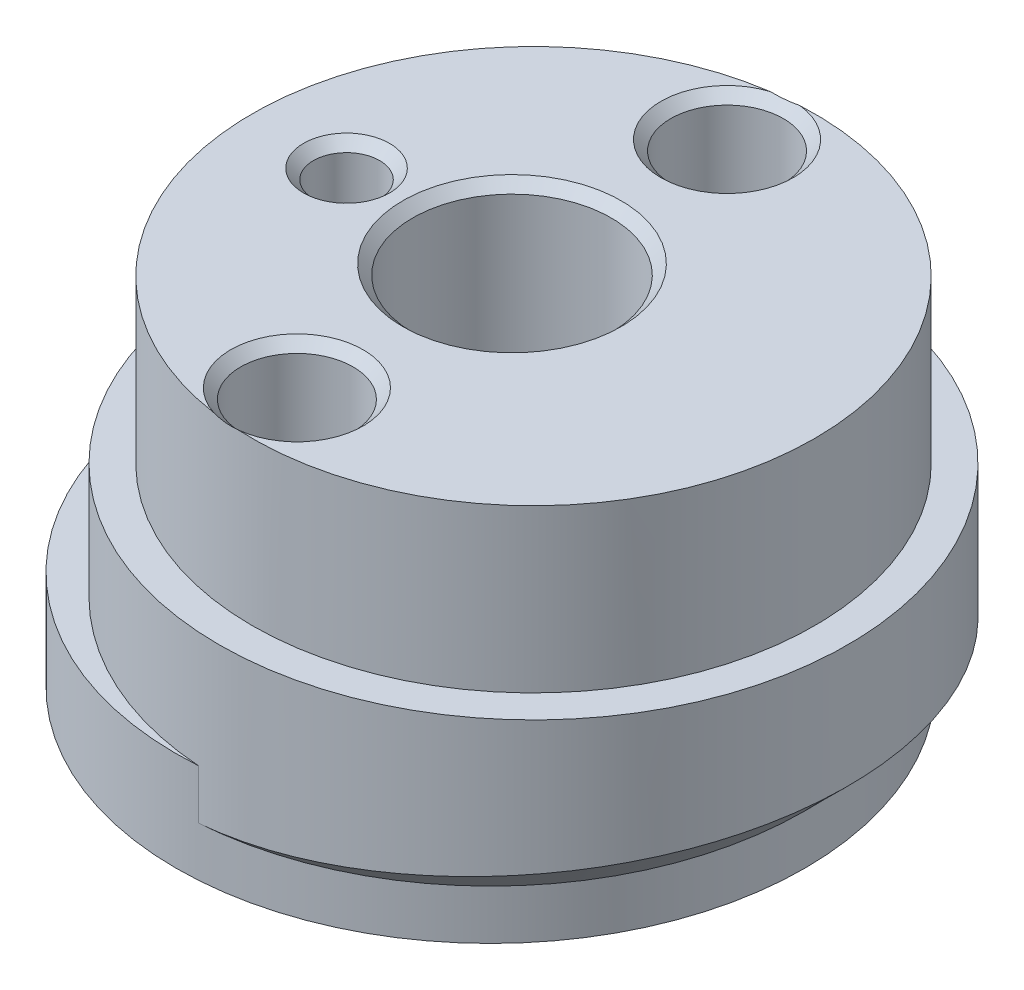
ISO-10303-21;
HEADER;
FILE_DESCRIPTION(('STEP AP214'),'2;1');
FILE_NAME('part.step','',(''),(''),'','','');
FILE_SCHEMA(('AUTOMOTIVE_DESIGN { 1 0 10303 214 1 1 1 1 }'));
ENDSEC;
DATA;
#1=APPLICATION_CONTEXT('core data for automotive mechanical design processes');
#2=APPLICATION_PROTOCOL_DEFINITION('international standard','automotive_design',2000,#1);
#3=PRODUCT_CONTEXT('',#1,'mechanical');
#4=PRODUCT('Part','Part','',(#3));
#5=PRODUCT_RELATED_PRODUCT_CATEGORY('part','',(#4));
#6=PRODUCT_DEFINITION_FORMATION('','',#4);
#7=PRODUCT_DEFINITION_CONTEXT('part definition',#1,'design');
#8=PRODUCT_DEFINITION('design','',#6,#7);
#9=PRODUCT_DEFINITION_SHAPE('','',#8);
#10=(LENGTH_UNIT() NAMED_UNIT(*) SI_UNIT(.MILLI.,.METRE.));
#11=(NAMED_UNIT(*) PLANE_ANGLE_UNIT() SI_UNIT($,.RADIAN.));
#12=(NAMED_UNIT(*) SI_UNIT($,.STERADIAN.) SOLID_ANGLE_UNIT());
#13=UNCERTAINTY_MEASURE_WITH_UNIT(LENGTH_MEASURE(1.E-05),#10,'distance_accuracy_value','');
#14=(GEOMETRIC_REPRESENTATION_CONTEXT(3) GLOBAL_UNCERTAINTY_ASSIGNED_CONTEXT((#13)) GLOBAL_UNIT_ASSIGNED_CONTEXT((#10,
#11,#12)) REPRESENTATION_CONTEXT('',''));
#15=CARTESIAN_POINT('',(0.,0.,0.));
#16=DIRECTION('',(0.,0.,1.));
#17=DIRECTION('',(1.,0.,0.));
#18=AXIS2_PLACEMENT_3D('',#15,#16,#17);
#19=CARTESIAN_POINT('',(-0.65,3.,0.));
#20=DIRECTION('',(0.,1.,0.));
#21=DIRECTION('',(0.,0.,1.));
#22=AXIS2_PLACEMENT_3D('',#19,#20,#21);
#23=PLANE('',#22);
#24=CARTESIAN_POINT('',(-0.65,3.,0.));
#25=DIRECTION('',(0.,1.,0.));
#26=DIRECTION('',(0.,0.,1.));
#27=AXIS2_PLACEMENT_3D('',#24,#25,#26);
#28=CIRCLE('',#27,9.5);
#29=CARTESIAN_POINT('',(0.,3.,-9.47773707168541));
#30=VERTEX_POINT('',#29);
#31=CARTESIAN_POINT('',(0.,3.,9.47773707168541));
#32=VERTEX_POINT('',#31);
#33=EDGE_CURVE('E85',#30,#32,#28,.T.);
#34=ORIENTED_EDGE('',*,*,#33,.T.);
#35=CARTESIAN_POINT('',(0.65,3.,0.));
#36=DIRECTION('',(0.,1.,0.));
#37=DIRECTION('',(0.,0.,1.));
#38=AXIS2_PLACEMENT_3D('',#35,#36,#37);
#39=CIRCLE('',#38,9.5);
#40=EDGE_CURVE('E93',#30,#32,#39,.T.);
#41=ORIENTED_EDGE('',*,*,#40,.F.);
#42=EDGE_LOOP('',(#34,#41));
#43=FACE_BOUND('',#42,.T.);
#44=ADVANCED_FACE('F37',(#43),#23,.T.);
#45=CARTESIAN_POINT('',(-0.65,0.,0.));
#46=DIRECTION('',(0.,1.,0.));
#47=DIRECTION('',(0.,0.,1.));
#48=AXIS2_PLACEMENT_3D('',#45,#46,#47);
#49=PLANE('',#48);
#50=CARTESIAN_POINT('',(0.,0.,-6.5));
#51=DIRECTION('',(0.,1.,0.));
#52=DIRECTION('',(0.,0.,1.));
#53=AXIS2_PLACEMENT_3D('',#50,#51,#52);
#54=CIRCLE('',#53,1.99999999999999);
#55=CARTESIAN_POINT('',(0.,0.,-4.50000000000001));
#56=VERTEX_POINT('',#55);
#57=EDGE_CURVE('E11',#56,#56,#54,.T.);
#58=ORIENTED_EDGE('',*,*,#57,.T.);
#59=EDGE_LOOP('',(#58));
#60=FACE_BOUND('',#59,.T.);
#61=CARTESIAN_POINT('',(-5.,0.,0.));
#62=DIRECTION('',(0.,1.,0.));
#63=DIRECTION('',(0.,0.,1.));
#64=AXIS2_PLACEMENT_3D('',#61,#62,#63);
#65=CIRCLE('',#64,1.3);
#66=CARTESIAN_POINT('',(-5.,0.,1.3));
#67=VERTEX_POINT('',#66);
#68=EDGE_CURVE('E46',#67,#67,#65,.T.);
#69=ORIENTED_EDGE('',*,*,#68,.T.);
#70=EDGE_LOOP('',(#69));
#71=FACE_BOUND('',#70,.T.);
#72=CARTESIAN_POINT('',(0.,0.,6.5));
#73=DIRECTION('',(0.,1.,0.));
#74=DIRECTION('',(0.,0.,1.));
#75=AXIS2_PLACEMENT_3D('',#72,#73,#74);
#76=CIRCLE('',#75,1.99999999999999);
#77=CARTESIAN_POINT('',(0.,0.,8.49999999999999));
#78=VERTEX_POINT('',#77);
#79=EDGE_CURVE('E194',#78,#78,#76,.T.);
#80=ORIENTED_EDGE('',*,*,#79,.T.);
#81=EDGE_LOOP('',(#80));
#82=FACE_BOUND('',#81,.T.);
#83=CARTESIAN_POINT('',(0.,0.,0.));
#84=DIRECTION('',(0.,1.,0.));
#85=DIRECTION('',(0.,0.,1.));
#86=AXIS2_PLACEMENT_3D('',#83,#84,#85);
#87=CIRCLE('',#86,3.3);
#88=CARTESIAN_POINT('',(0.,0.,3.3));
#89=VERTEX_POINT('',#88);
#90=EDGE_CURVE('E198',#89,#89,#87,.T.);
#91=ORIENTED_EDGE('',*,*,#90,.T.);
#92=EDGE_LOOP('',(#91));
#93=FACE_BOUND('',#92,.T.);
#94=CARTESIAN_POINT('',(-0.65,0.,0.));
#95=DIRECTION('',(0.,1.,0.));
#96=DIRECTION('',(0.,0.,1.));
#97=AXIS2_PLACEMENT_3D('',#94,#95,#96);
#98=CIRCLE('',#97,9.5);
#99=CARTESIAN_POINT('',(-0.65,0.,9.5));
#100=VERTEX_POINT('',#99);
#101=EDGE_CURVE('E94',#100,#100,#98,.T.);
#102=ORIENTED_EDGE('',*,*,#101,.F.);
#103=EDGE_LOOP('',(#102));
#104=FACE_BOUND('',#103,.T.);
#105=ADVANCED_FACE('F179',(#60,#71,#82,#93,#104),#49,.F.);
#106=CARTESIAN_POINT('',(-0.65,3.,0.));
#107=DIRECTION('',(0.,-1.,0.));
#108=DIRECTION('',(0.,0.,-1.));
#109=AXIS2_PLACEMENT_3D('',#106,#107,#108);
#110=CYLINDRICAL_SURFACE('',#109,9.5);
#111=ORIENTED_EDGE('',*,*,#33,.F.);
#112=DIRECTION('',(0.,-1.,0.));
#113=VECTOR('',#112,1.);
#114=CARTESIAN_POINT('',(0.,3.,-9.47773707168541));
#115=LINE('',#114,#113);
#116=CARTESIAN_POINT('',(0.,1.49999999999999,-9.47773707168541));
#117=VERTEX_POINT('',#116);
#118=EDGE_CURVE('E97',#30,#117,#115,.T.);
#119=ORIENTED_EDGE('',*,*,#118,.T.);
#120=CARTESIAN_POINT('',(-0.65,1.49999999999999,0.));
#121=DIRECTION('',(0.,1.,0.));
#122=DIRECTION('',(0.,0.,1.));
#123=AXIS2_PLACEMENT_3D('',#120,#121,#122);
#124=CIRCLE('',#123,9.5);
#125=CARTESIAN_POINT('',(0.,1.49999999999999,9.47773707168541));
#126=VERTEX_POINT('',#125);
#127=EDGE_CURVE('E88',#117,#126,#124,.F.);
#128=ORIENTED_EDGE('',*,*,#127,.T.);
#129=DIRECTION('',(0.,-1.,0.));
#130=VECTOR('',#129,1.);
#131=CARTESIAN_POINT('',(0.,1.49999999999999,9.47773707168541));
#132=LINE('',#131,#130);
#133=EDGE_CURVE('E80',#126,#32,#132,.F.);
#134=ORIENTED_EDGE('',*,*,#133,.T.);
#135=EDGE_LOOP('',(#111,#119,#128,#134));
#136=FACE_BOUND('',#135,.T.);
#137=ORIENTED_EDGE('',*,*,#101,.T.);
#138=EDGE_LOOP('',(#137));
#139=FACE_BOUND('',#138,.T.);
#140=ADVANCED_FACE('F82',(#136,#139),#110,.T.);
#141=CARTESIAN_POINT('',(0.,3.,0.));
#142=DIRECTION('',(0.,-1.,0.));
#143=DIRECTION('',(0.,0.,-1.));
#144=AXIS2_PLACEMENT_3D('',#141,#142,#143);
#145=CYLINDRICAL_SURFACE('',#144,3.);
#146=CARTESIAN_POINT('',(0.,11.1,0.));
#147=DIRECTION('',(0.,1.,0.));
#148=DIRECTION('',(0.,0.,1.));
#149=AXIS2_PLACEMENT_3D('',#146,#147,#148);
#150=CIRCLE('',#149,3.);
#151=CARTESIAN_POINT('',(0.,11.1,3.));
#152=VERTEX_POINT('',#151);
#153=EDGE_CURVE('E210',#152,#152,#150,.T.);
#154=ORIENTED_EDGE('',*,*,#153,.T.);
#155=EDGE_LOOP('',(#154));
#156=FACE_BOUND('',#155,.T.);
#157=CARTESIAN_POINT('',(0.,0.300000000000004,0.));
#158=DIRECTION('',(0.,1.,0.));
#159=DIRECTION('',(0.,0.,1.));
#160=AXIS2_PLACEMENT_3D('',#157,#158,#159);
#161=CIRCLE('',#160,3.);
#162=CARTESIAN_POINT('',(0.,0.300000000000004,3.));
#163=VERTEX_POINT('',#162);
#164=EDGE_CURVE('E213',#163,#163,#161,.F.);
#165=ORIENTED_EDGE('',*,*,#164,.T.);
#166=EDGE_LOOP('',(#165));
#167=FACE_BOUND('',#166,.T.);
#168=ADVANCED_FACE('F173',(#156,#167),#145,.F.);
#169=CARTESIAN_POINT('',(0.65,11.4,0.));
#170=DIRECTION('',(0.,1.,0.));
#171=DIRECTION('',(0.,0.,1.));
#172=AXIS2_PLACEMENT_3D('',#169,#170,#171);
#173=PLANE('',#172);
#174=CARTESIAN_POINT('',(0.,11.4,0.));
#175=DIRECTION('',(0.,1.,0.));
#176=DIRECTION('',(0.,0.,1.));
#177=AXIS2_PLACEMENT_3D('',#174,#175,#176);
#178=CIRCLE('',#177,3.3);
#179=CARTESIAN_POINT('',(0.,11.4,3.3));
#180=VERTEX_POINT('',#179);
#181=EDGE_CURVE('E265',#180,#180,#178,.F.);
#182=ORIENTED_EDGE('',*,*,#181,.T.);
#183=EDGE_LOOP('',(#182));
#184=FACE_BOUND('',#183,.T.);
#185=CARTESIAN_POINT('',(-5.,11.4,0.));
#186=DIRECTION('',(0.,1.,0.));
#187=DIRECTION('',(0.,0.,1.));
#188=AXIS2_PLACEMENT_3D('',#185,#186,#187);
#189=CIRCLE('',#188,1.3);
#190=CARTESIAN_POINT('',(-5.,11.4,1.3));
#191=VERTEX_POINT('',#190);
#192=EDGE_CURVE('E261',#191,#191,#189,.F.);
#193=ORIENTED_EDGE('',*,*,#192,.T.);
#194=EDGE_LOOP('',(#193));
#195=FACE_BOUND('',#194,.T.);
#196=CARTESIAN_POINT('',(0.65,11.4,0.));
#197=DIRECTION('',(0.,1.,0.));
#198=DIRECTION('',(0.,0.,1.));
#199=AXIS2_PLACEMENT_3D('',#196,#197,#198);
#200=CIRCLE('',#199,8.5);
#201=CARTESIAN_POINT('',(-0.60176007472003,11.4,-8.407323992528));
#202=VERTEX_POINT('',#201);
#203=CARTESIAN_POINT('',(-0.601760074720063,11.4,8.40732399252799));
#204=VERTEX_POINT('',#203);
#205=EDGE_CURVE('E108',#202,#204,#200,.T.);
#206=ORIENTED_EDGE('',*,*,#205,.T.);
#207=CARTESIAN_POINT('',(0.,11.4,6.5));
#208=DIRECTION('',(0.,1.,0.));
#209=DIRECTION('',(0.,0.,1.));
#210=AXIS2_PLACEMENT_3D('',#207,#208,#209);
#211=CIRCLE('',#210,2.00000000000001);
#212=CARTESIAN_POINT('',(0.212156114324024,11.4,8.4887156114324));
#213=VERTEX_POINT('',#212);
#214=EDGE_CURVE('E272',#204,#213,#211,.F.);
#215=ORIENTED_EDGE('',*,*,#214,.T.);
#216=CARTESIAN_POINT('',(0.212156114323991,11.4,-8.4887156114324));
#217=VERTEX_POINT('',#216);
#218=EDGE_CURVE('E102',#213,#217,#200,.T.);
#219=ORIENTED_EDGE('',*,*,#218,.T.);
#220=CARTESIAN_POINT('',(0.,11.4,-6.5));
#221=DIRECTION('',(0.,1.,0.));
#222=DIRECTION('',(0.,0.,1.));
#223=AXIS2_PLACEMENT_3D('',#220,#221,#222);
#224=CIRCLE('',#223,2.);
#225=EDGE_CURVE('E270',#217,#202,#224,.F.);
#226=ORIENTED_EDGE('',*,*,#225,.T.);
#227=EDGE_LOOP('',(#206,#215,#219,#226));
#228=FACE_BOUND('',#227,.T.);
#229=ADVANCED_FACE('F171',(#184,#195,#228),#173,.T.);
#230=CARTESIAN_POINT('',(0.65,11.4,0.));
#231=DIRECTION('',(0.,-1.,0.));
#232=DIRECTION('',(0.,0.,-1.));
#233=AXIS2_PLACEMENT_3D('',#230,#231,#232);
#234=CYLINDRICAL_SURFACE('',#233,8.5);
#235=CARTESIAN_POINT('',(0.65,6.5,0.));
#236=DIRECTION('',(0.,1.,0.));
#237=DIRECTION('',(0.,0.,1.));
#238=AXIS2_PLACEMENT_3D('',#235,#236,#237);
#239=CIRCLE('',#238,8.5);
#240=CARTESIAN_POINT('',(0.65,6.5,8.5));
#241=VERTEX_POINT('',#240);
#242=EDGE_CURVE('E99',#241,#241,#239,.T.);
#243=ORIENTED_EDGE('',*,*,#242,.T.);
#244=EDGE_LOOP('',(#243));
#245=FACE_BOUND('',#244,.T.);
#246=ORIENTED_EDGE('',*,*,#218,.F.);
#247=CARTESIAN_POINT('',(0.212156114324024,11.4,8.4887156114324));
#248=CARTESIAN_POINT('',(0.144388372843662,11.3892925743724,8.48522715447326));
#249=CARTESIAN_POINT('',(0.0762379554762486,11.3811689720129,8.48089135470946));
#250=CARTESIAN_POINT('',(-0.0598975572980804,11.3703312636197,8.47057520845634));
#251=CARTESIAN_POINT('',(-0.127880639625246,11.3675808462714,8.46460621399023));
#252=CARTESIAN_POINT('',(-0.263682583731735,11.3675808462714,8.45102601957958));
#253=CARTESIAN_POINT('',(-0.331501445511057,11.3703312636197,8.44341481963504));
#254=CARTESIAN_POINT('',(-0.466984006795423,11.3811689720129,8.42656915848229));
#255=CARTESIAN_POINT('',(-0.534643485158293,11.3892925743724,8.41732396867306));
#256=CARTESIAN_POINT('',(-0.601760074720063,11.4,8.40732399252799));
#257=B_SPLINE_CURVE_WITH_KNOTS('',3,(#247,#248,#249,#250,#251,#252,#253,#254,#255,#256),
.UNSPECIFIED.,.F.,.F.,(4,2,2,2,4),(0.,0.206064885541673,0.410732326139946,0.615399766738218,
0.821464652279891),.UNSPECIFIED.);
#258=EDGE_CURVE('E52',#213,#204,#257,.T.);
#259=ORIENTED_EDGE('',*,*,#258,.T.);
#260=ORIENTED_EDGE('',*,*,#205,.F.);
#261=CARTESIAN_POINT('',(-0.60176007472003,11.4,-8.407323992528));
#262=CARTESIAN_POINT('',(-0.534643485158266,11.3892925743724,-8.41732396867306));
#263=CARTESIAN_POINT('',(-0.466984006795401,11.3811689720129,-8.42656915848229));
#264=CARTESIAN_POINT('',(-0.331501445511047,11.3703312636197,-8.44341481963504));
#265=CARTESIAN_POINT('',(-0.26368258373173,11.3675808462714,-8.45102601957958));
#266=CARTESIAN_POINT('',(-0.127880639625252,11.3675808462714,-8.46460621399023));
#267=CARTESIAN_POINT('',(-0.0598975572980918,11.3703312636197,-8.47057520845634));
#268=CARTESIAN_POINT('',(0.0762379554762261,11.3811689720129,-8.48089135470946));
#269=CARTESIAN_POINT('',(0.144388372843634,11.3892925743724,-8.48522715447326));
#270=CARTESIAN_POINT('',(0.212156114323991,11.4,-8.4887156114324));
#271=B_SPLINE_CURVE_WITH_KNOTS('',3,(#261,#262,#263,#264,#265,#266,#267,#268,#269,#270),
.UNSPECIFIED.,.F.,.F.,(4,2,2,2,4),(0.,0.206064885541656,0.410732326139912,0.615399766738168,
0.821464652279824),.UNSPECIFIED.);
#272=EDGE_CURVE('E159',#202,#217,#271,.T.);
#273=ORIENTED_EDGE('',*,*,#272,.T.);
#274=EDGE_LOOP('',(#246,#259,#260,#273));
#275=FACE_BOUND('',#274,.T.);
#276=ADVANCED_FACE('F166',(#245,#275),#234,.T.);
#277=CARTESIAN_POINT('',(0.65,6.5,0.));
#278=DIRECTION('',(0.,1.,0.));
#279=DIRECTION('',(0.,0.,1.));
#280=AXIS2_PLACEMENT_3D('',#277,#278,#279);
#281=PLANE('',#280);
#282=CARTESIAN_POINT('',(0.65,6.5,0.));
#283=DIRECTION('',(0.,1.,0.));
#284=DIRECTION('',(0.,0.,1.));
#285=AXIS2_PLACEMENT_3D('',#282,#283,#284);
#286=CIRCLE('',#285,9.5);
#287=CARTESIAN_POINT('',(0.65,6.5,9.5));
#288=VERTEX_POINT('',#287);
#289=EDGE_CURVE('E98',#288,#288,#286,.T.);
#290=ORIENTED_EDGE('',*,*,#289,.T.);
#291=EDGE_LOOP('',(#290));
#292=FACE_BOUND('',#291,.T.);
#293=ORIENTED_EDGE('',*,*,#242,.F.);
#294=EDGE_LOOP('',(#293));
#295=FACE_BOUND('',#294,.T.);
#296=ADVANCED_FACE('F170',(#292,#295),#281,.T.);
#297=CARTESIAN_POINT('',(0.65,6.5,0.));
#298=DIRECTION('',(0.,-1.,0.));
#299=DIRECTION('',(0.,0.,-1.));
#300=AXIS2_PLACEMENT_3D('',#297,#298,#299);
#301=CYLINDRICAL_SURFACE('',#300,9.5);
#302=ORIENTED_EDGE('',*,*,#289,.F.);
#303=EDGE_LOOP('',(#302));
#304=FACE_BOUND('',#303,.T.);
#305=ORIENTED_EDGE('',*,*,#40,.T.);
#306=ORIENTED_EDGE('',*,*,#133,.F.);
#307=CARTESIAN_POINT('',(0.,1.49999999999999,9.47773707168541));
#308=CARTESIAN_POINT('',(0.232436584391314,1.53180821684885,9.49369332138629));
#309=CARTESIAN_POINT('',(0.465470345312506,1.563536225383,9.50106951453613));
#310=CARTESIAN_POINT('',(0.931466069386569,1.62667141698054,9.49868320359915));
#311=CARTESIAN_POINT('',(1.16442803774315,1.6580786370265,9.48892269809398));
#312=CARTESIAN_POINT('',(1.62920901122623,1.72043814462735,9.45227706347286));
#313=CARTESIAN_POINT('',(1.8610272417912,1.75139014621388,9.42538160397508));
#314=CARTESIAN_POINT('',(2.32215274271935,1.81267221106095,9.35458839540783));
#315=CARTESIAN_POINT('',(2.5514597599179,1.84300221187944,9.31068894803707));
#316=CARTESIAN_POINT('',(3.04157480360545,1.9075370506566,9.19798893888884));
#317=CARTESIAN_POINT('',(3.30175984199074,1.941614292781,9.12638437549389));
#318=CARTESIAN_POINT('',(3.81525681363404,2.00853574698814,8.96124446939764));
#319=CARTESIAN_POINT('',(4.06856806322071,2.04137983654447,8.86770695408664));
#320=CARTESIAN_POINT('',(4.56645435283187,2.10563275767199,8.65934203190355));
#321=CARTESIAN_POINT('',(4.81102985300043,2.13704166486392,8.54451574836744));
#322=CARTESIAN_POINT('',(5.28967090615107,2.19823910396925,8.29435791194216));
#323=CARTESIAN_POINT('',(5.52373650303971,2.22802764265206,8.15902644472654));
#324=CARTESIAN_POINT('',(5.97848781651825,2.28566452822138,7.86952997173259));
#325=CARTESIAN_POINT('',(6.19923513720743,2.31352191413262,7.7154635357134));
#326=CARTESIAN_POINT('',(6.62701004842578,2.36730193225397,7.38902824390842));
#327=CARTESIAN_POINT('',(6.83403757816316,2.39322455589131,7.21665930703388));
#328=CARTESIAN_POINT('',(7.23284774632427,2.44298920010898,6.85482388101035));
#329=CARTESIAN_POINT('',(7.42463011624049,2.46683118404447,6.66535709084847));
#330=CARTESIAN_POINT('',(7.79152017615291,2.51230086474213,6.27066861411746));
#331=CARTESIAN_POINT('',(7.96662800099755,2.53392857941137,6.06544705498272));
#332=CARTESIAN_POINT('',(8.2975777600226,2.57469217089468,5.64235163886782));
#333=CARTESIAN_POINT('',(8.45355792531459,2.59384598719644,5.4245876260193));
#334=CARTESIAN_POINT('',(8.74665830851183,2.62975230375792,4.97652403175809));
#335=CARTESIAN_POINT('',(8.88377829476701,2.64650477452325,4.74622429642393));
#336=CARTESIAN_POINT('',(9.13815920698065,2.67752099475245,4.27468509180481));
#337=CARTESIAN_POINT('',(9.25541610553925,2.69178423952354,4.03344341649459));
#338=CARTESIAN_POINT('',(9.4691560548584,2.71774109930763,3.54179816560406));
#339=CARTESIAN_POINT('',(9.56563956384372,2.72943477100106,3.29139479225741));
#340=CARTESIAN_POINT('',(9.73655811724458,2.7501236030752,2.78486076659791));
#341=CARTESIAN_POINT('',(9.81113088321605,2.75913562394349,2.52877726737606));
#342=CARTESIAN_POINT('',(9.93849779913183,2.77451407015589,2.01117884292822));
#343=CARTESIAN_POINT('',(9.99129247361882,2.78088055921976,1.74966404867865));
#344=CARTESIAN_POINT('',(10.0746605163158,2.7909287192388,1.22338295574531));
#345=CARTESIAN_POINT('',(10.1052603580091,2.79461358878522,0.958620915079021));
#346=CARTESIAN_POINT('',(10.1441087893971,2.79929109671774,0.427528036218858));
#347=CARTESIAN_POINT('',(10.1523640149439,2.8002845343991,0.161197687329976));
#348=CARTESIAN_POINT('',(10.1460108959082,2.79951985614703,-0.413196254885565));
#349=CARTESIAN_POINT('',(10.1275954363374,2.79730356801804,-0.721223988292627));
#350=CARTESIAN_POINT('',(10.0609224684857,2.78927311993757,-1.33398679388979));
#351=CARTESIAN_POINT('',(10.0126647103961,2.7834589298682,-1.6387218384952));
#352=CARTESIAN_POINT('',(9.89502855725859,2.7692672581326,-2.20254918652843));
#353=CARTESIAN_POINT('',(9.82923048043059,2.76132357345043,-2.46240590741267));
#354=CARTESIAN_POINT('',(9.67592561702521,2.74278793358012,-2.9756352350986));
#355=CARTESIAN_POINT('',(9.58841217676339,2.73219516669351,-3.2290058282234));
#356=CARTESIAN_POINT('',(9.39222823588825,2.70840487477214,-3.72764241019848));
#357=CARTESIAN_POINT('',(9.28353237505346,2.69520422724236,-3.97289826799793));
#358=CARTESIAN_POINT('',(9.04586478884183,2.66627664961125,-4.45322968226967));
#359=CARTESIAN_POINT('',(8.91689280248467,2.65054968699288,-4.68830510765676));
#360=CARTESIAN_POINT('',(8.64090347596971,2.61680888604399,-5.14450049865271));
#361=CARTESIAN_POINT('',(8.49406135899511,2.5988172023079,-5.36572814900869));
#362=CARTESIAN_POINT('',(8.18248678758145,2.56053180379765,-5.79499615974519));
#363=CARTESIAN_POINT('',(8.0177541297776,2.5402380628555,-6.00303637017929));
#364=CARTESIAN_POINT('',(7.67169537053372,2.49746945010971,-6.40437041371224));
#365=CARTESIAN_POINT('',(7.49037893623939,2.47499584855114,-6.59767271895057));
#366=CARTESIAN_POINT('',(7.11229678899895,2.42796838552798,-6.96841804302689));
#367=CARTESIAN_POINT('',(6.91552455581397,2.40341364575792,-7.14585430032387));
#368=CARTESIAN_POINT('',(6.50679209760863,2.35221322068639,-7.48457431358038));
#369=CARTESIAN_POINT('',(6.29474848087738,2.32555596504399,-7.64575569555617));
#370=CARTESIAN_POINT('',(5.85813491226568,2.27043863693001,-7.94959367745174));
#371=CARTESIAN_POINT('',(5.63357016511824,2.24197931287741,-8.09225789364692));
#372=CARTESIAN_POINT('',(5.17327975050108,2.18338774772581,-8.35826807709909));
#373=CARTESIAN_POINT('',(4.93754662698258,2.15325438664954,-8.4816008950685));
#374=CARTESIAN_POINT('',(4.456739850499,2.09150517435469,-8.70800429005668));
#375=CARTESIAN_POINT('',(4.21166645998743,2.05988936478591,-8.81107543591067));
#376=CARTESIAN_POINT('',(3.71183380276946,1.99509010255401,-8.99704768595076));
#377=CARTESIAN_POINT('',(3.45701107709749,1.96189582587695,-9.07977447561619));
#378=CARTESIAN_POINT('',(2.94143306272732,1.89438553611957,-9.22339102527994));
#379=CARTESIAN_POINT('',(2.68067786283761,1.8600695398279,-9.28428111194287));
#380=CARTESIAN_POINT('',(2.1554602556977,1.79057722208004,-9.38375915266908));
#381=CARTESIAN_POINT('',(1.89100363742311,1.7554021912552,-9.42237864777947));
#382=CARTESIAN_POINT('',(1.35997597734251,1.68437903173459,-9.47718956387327));
#383=CARTESIAN_POINT('',(1.09340611816341,1.64853126601051,-9.49339274580365));
#384=CARTESIAN_POINT('',(0.688742602638314,1.59380422752349,-9.50092414274325));
#385=CARTESIAN_POINT('',(0.550734397775085,1.57508544314292,-9.50048348119238));
#386=CARTESIAN_POINT('',(0.275086760629968,1.53758757821641,-9.49359860986214));
#387=CARTESIAN_POINT('',(0.137447085635779,1.51880863004613,-9.48716339681042));
#388=CARTESIAN_POINT('',(0.,1.49999999999999,-9.47773707168541));
#389=B_SPLINE_CURVE_WITH_KNOTS('',3,(#307,#308,#309,#310,#311,#312,#313,#314,#315,#316,#317,
#318,#319,#320,#321,#322,#323,#324,#325,#326,#327,#328,#329,#330,#331,#332,#333,#334,#335,#336,
#337,#338,#339,#340,#341,#342,#343,#344,#345,#346,#347,#348,#349,#350,#351,#352,#353,#354,#355,
#356,#357,#358,#359,#360,#361,#362,#363,#364,#365,#366,#367,#368,#369,#370,#371,#372,#373,#374,
#375,#376,#377,#378,#379,#380,#381,#382,#383,#384,#385,#386,#387,#388),.UNSPECIFIED.,.F.,.F.,(4,
2,2,2,2,2,2,2,2,2,2,2,2,2,2,2,2,2,2,2,2,2,2,2,2,2,2,2,2,2,2,2,2,2,2,2,2,2,2,2,4),(0.,
0.705274449051662,1.41046665035117,2.11608440326432,2.82177264909223,3.63678092014131,
4.45186995749426,5.26691599760207,6.08195863242664,6.8928849348359,7.70381483018291,
8.51475900498275,9.32569662105216,10.1303770016659,10.9350672648802,11.7399204906961,
12.5447559610333,13.3444186975758,14.14406217248,14.9427502755812,15.741201160109,
16.6654494954795,17.589705567801,18.3932850038446,19.1971109649165,20.0019052690012,
20.8067099326911,21.6041778401001,22.4016548134094,23.1986698424502,23.9960229278514,
24.7981196054806,25.5998853210282,26.4021940557483,27.2044802628766,28.0134182075097,
28.8223440503886,29.6301214087431,30.4374747975498,30.8551793169807,31.2722579464565),.UNSPECIFIED.);
#390=EDGE_CURVE('E114',#126,#117,#389,.T.);
#391=ORIENTED_EDGE('',*,*,#390,.T.);
#392=ORIENTED_EDGE('',*,*,#118,.F.);
#393=EDGE_LOOP('',(#305,#306,#391,#392));
#394=FACE_BOUND('',#393,.T.);
#395=ADVANCED_FACE('F96',(#304,#394),#301,.T.);
#396=CARTESIAN_POINT('',(-0.65,3.,0.));
#397=DIRECTION('',(0.,1.,0.));
#398=DIRECTION('',(0.,0.,1.));
#399=AXIS2_PLACEMENT_3D('',#396,#397,#398);
#400=CONICAL_SURFACE('',#399,11.,0.785398163397453);
#401=ORIENTED_EDGE('',*,*,#390,.F.);
#402=ORIENTED_EDGE('',*,*,#127,.F.);
#403=EDGE_LOOP('',(#401,#402));
#404=FACE_BOUND('',#403,.T.);
#405=ADVANCED_FACE('F128',(#404),#400,.T.);
#406=CARTESIAN_POINT('',(-5.,0.,0.));
#407=DIRECTION('',(0.,1.,0.));
#408=DIRECTION('',(0.,0.,1.));
#409=AXIS2_PLACEMENT_3D('',#406,#407,#408);
#410=CYLINDRICAL_SURFACE('',#409,1.);
#411=CARTESIAN_POINT('',(-5.,11.1,0.));
#412=DIRECTION('',(0.,1.,0.));
#413=DIRECTION('',(0.,0.,1.));
#414=AXIS2_PLACEMENT_3D('',#411,#412,#413);
#415=CIRCLE('',#414,1.);
#416=CARTESIAN_POINT('',(-5.,11.1,1.));
#417=VERTEX_POINT('',#416);
#418=EDGE_CURVE('E201',#417,#417,#415,.T.);
#419=ORIENTED_EDGE('',*,*,#418,.T.);
#420=EDGE_LOOP('',(#419));
#421=FACE_BOUND('',#420,.T.);
#422=CARTESIAN_POINT('',(-5.,0.300000000000002,0.));
#423=DIRECTION('',(0.,1.,0.));
#424=DIRECTION('',(0.,0.,1.));
#425=AXIS2_PLACEMENT_3D('',#422,#423,#424);
#426=CIRCLE('',#425,1.);
#427=CARTESIAN_POINT('',(-5.,0.300000000000002,1.));
#428=VERTEX_POINT('',#427);
#429=EDGE_CURVE('E205',#428,#428,#426,.F.);
#430=ORIENTED_EDGE('',*,*,#429,.T.);
#431=EDGE_LOOP('',(#430));
#432=FACE_BOUND('',#431,.T.);
#433=ADVANCED_FACE('F136',(#421,#432),#410,.F.);
#434=CARTESIAN_POINT('',(0.,11.4,6.5));
#435=DIRECTION('',(0.,1.,0.));
#436=DIRECTION('',(0.,0.,1.));
#437=AXIS2_PLACEMENT_3D('',#434,#435,#436);
#438=CYLINDRICAL_SURFACE('',#437,1.7);
#439=CARTESIAN_POINT('',(0.,11.1,6.5));
#440=DIRECTION('',(0.,1.,0.));
#441=DIRECTION('',(0.,0.,1.));
#442=AXIS2_PLACEMENT_3D('',#439,#440,#441);
#443=CIRCLE('',#442,1.7);
#444=CARTESIAN_POINT('',(0.,11.1,8.2));
#445=VERTEX_POINT('',#444);
#446=EDGE_CURVE('E259',#445,#445,#443,.T.);
#447=ORIENTED_EDGE('',*,*,#446,.T.);
#448=EDGE_LOOP('',(#447));
#449=FACE_BOUND('',#448,.T.);
#450=CARTESIAN_POINT('',(0.,0.299999999999996,6.5));
#451=DIRECTION('',(0.,1.,0.));
#452=DIRECTION('',(0.,0.,1.));
#453=AXIS2_PLACEMENT_3D('',#450,#451,#452);
#454=CIRCLE('',#453,1.7);
#455=CARTESIAN_POINT('',(0.,0.299999999999996,8.2));
#456=VERTEX_POINT('',#455);
#457=EDGE_CURVE('E122',#456,#456,#454,.F.);
#458=ORIENTED_EDGE('',*,*,#457,.T.);
#459=EDGE_LOOP('',(#458));
#460=FACE_BOUND('',#459,.T.);
#461=ADVANCED_FACE('F305',(#449,#460),#438,.F.);
#462=CARTESIAN_POINT('',(0.,11.4,-6.5));
#463=DIRECTION('',(0.,1.,0.));
#464=DIRECTION('',(0.,0.,1.));
#465=AXIS2_PLACEMENT_3D('',#462,#463,#464);
#466=CYLINDRICAL_SURFACE('',#465,1.7);
#467=CARTESIAN_POINT('',(0.,11.1,-6.5));
#468=DIRECTION('',(0.,1.,0.));
#469=DIRECTION('',(0.,0.,1.));
#470=AXIS2_PLACEMENT_3D('',#467,#468,#469);
#471=CIRCLE('',#470,1.7);
#472=CARTESIAN_POINT('',(0.,11.1,-4.8));
#473=VERTEX_POINT('',#472);
#474=EDGE_CURVE('E215',#473,#473,#471,.T.);
#475=ORIENTED_EDGE('',*,*,#474,.T.);
#476=EDGE_LOOP('',(#475));
#477=FACE_BOUND('',#476,.T.);
#478=CARTESIAN_POINT('',(0.,0.3,-6.5));
#479=DIRECTION('',(0.,1.,0.));
#480=DIRECTION('',(0.,0.,1.));
#481=AXIS2_PLACEMENT_3D('',#478,#479,#480);
#482=CIRCLE('',#481,1.7);
#483=CARTESIAN_POINT('',(0.,0.3,-4.8));
#484=VERTEX_POINT('',#483);
#485=EDGE_CURVE('E158',#484,#484,#482,.F.);
#486=ORIENTED_EDGE('',*,*,#485,.T.);
#487=EDGE_LOOP('',(#486));
#488=FACE_BOUND('',#487,.T.);
#489=ADVANCED_FACE('F147',(#477,#488),#466,.F.);
#490=CARTESIAN_POINT('',(0.,11.1,6.5));
#491=DIRECTION('',(0.,1.,0.));
#492=DIRECTION('',(0.,0.,1.));
#493=AXIS2_PLACEMENT_3D('',#490,#491,#492);
#494=CONICAL_SURFACE('',#493,1.7,0.785398163397455);
#495=ORIENTED_EDGE('',*,*,#258,.F.);
#496=ORIENTED_EDGE('',*,*,#214,.F.);
#497=EDGE_LOOP('',(#495,#496));
#498=FACE_BOUND('',#497,.T.);
#499=ORIENTED_EDGE('',*,*,#446,.F.);
#500=EDGE_LOOP('',(#499));
#501=FACE_BOUND('',#500,.T.);
#502=ADVANCED_FACE('F139',(#498,#501),#494,.F.);
#503=CARTESIAN_POINT('',(0.,11.1,-6.5));
#504=DIRECTION('',(0.,1.,0.));
#505=DIRECTION('',(0.,0.,1.));
#506=AXIS2_PLACEMENT_3D('',#503,#504,#505);
#507=CONICAL_SURFACE('',#506,1.7,0.785398163397445);
#508=ORIENTED_EDGE('',*,*,#272,.F.);
#509=ORIENTED_EDGE('',*,*,#225,.F.);
#510=EDGE_LOOP('',(#508,#509));
#511=FACE_BOUND('',#510,.T.);
#512=ORIENTED_EDGE('',*,*,#474,.F.);
#513=EDGE_LOOP('',(#512));
#514=FACE_BOUND('',#513,.T.);
#515=ADVANCED_FACE('F146',(#511,#514),#507,.F.);
#516=CARTESIAN_POINT('',(0.,11.1,0.));
#517=DIRECTION('',(0.,1.,0.));
#518=DIRECTION('',(0.,0.,1.));
#519=AXIS2_PLACEMENT_3D('',#516,#517,#518);
#520=CONICAL_SURFACE('',#519,3.,0.785398163397452);
#521=ORIENTED_EDGE('',*,*,#181,.F.);
#522=EDGE_LOOP('',(#521));
#523=FACE_BOUND('',#522,.T.);
#524=ORIENTED_EDGE('',*,*,#153,.F.);
#525=EDGE_LOOP('',(#524));
#526=FACE_BOUND('',#525,.T.);
#527=ADVANCED_FACE('F236',(#523,#526),#520,.F.);
#528=CARTESIAN_POINT('',(-5.,11.1,0.));
#529=DIRECTION('',(0.,1.,0.));
#530=DIRECTION('',(0.,0.,1.));
#531=AXIS2_PLACEMENT_3D('',#528,#529,#530);
#532=CONICAL_SURFACE('',#531,1.,0.785398163397453);
#533=ORIENTED_EDGE('',*,*,#192,.F.);
#534=EDGE_LOOP('',(#533));
#535=FACE_BOUND('',#534,.T.);
#536=ORIENTED_EDGE('',*,*,#418,.F.);
#537=EDGE_LOOP('',(#536));
#538=FACE_BOUND('',#537,.T.);
#539=ADVANCED_FACE('F227',(#535,#538),#532,.F.);
#540=CARTESIAN_POINT('',(0.,0.,-6.5));
#541=DIRECTION('',(0.,-1.,0.));
#542=DIRECTION('',(0.,0.,-1.));
#543=AXIS2_PLACEMENT_3D('',#540,#541,#542);
#544=CONICAL_SURFACE('',#543,1.99999999999999,0.785398163397442);
#545=ORIENTED_EDGE('',*,*,#485,.F.);
#546=EDGE_LOOP('',(#545));
#547=FACE_BOUND('',#546,.T.);
#548=ORIENTED_EDGE('',*,*,#57,.F.);
#549=EDGE_LOOP('',(#548));
#550=FACE_BOUND('',#549,.T.);
#551=ADVANCED_FACE('F223',(#547,#550),#544,.F.);
#552=CARTESIAN_POINT('',(-5.,0.,0.));
#553=DIRECTION('',(0.,-1.,0.));
#554=DIRECTION('',(0.,0.,-1.));
#555=AXIS2_PLACEMENT_3D('',#552,#553,#554);
#556=CONICAL_SURFACE('',#555,1.3,0.785398163397443);
#557=ORIENTED_EDGE('',*,*,#429,.F.);
#558=EDGE_LOOP('',(#557));
#559=FACE_BOUND('',#558,.T.);
#560=ORIENTED_EDGE('',*,*,#68,.F.);
#561=EDGE_LOOP('',(#560));
#562=FACE_BOUND('',#561,.T.);
#563=ADVANCED_FACE('F226',(#559,#562),#556,.F.);
#564=CARTESIAN_POINT('',(0.,0.,6.5));
#565=DIRECTION('',(0.,-1.,0.));
#566=DIRECTION('',(0.,0.,-1.));
#567=AXIS2_PLACEMENT_3D('',#564,#565,#566);
#568=CONICAL_SURFACE('',#567,1.99999999999999,0.785398163397444);
#569=ORIENTED_EDGE('',*,*,#457,.F.);
#570=EDGE_LOOP('',(#569));
#571=FACE_BOUND('',#570,.T.);
#572=ORIENTED_EDGE('',*,*,#79,.F.);
#573=EDGE_LOOP('',(#572));
#574=FACE_BOUND('',#573,.T.);
#575=ADVANCED_FACE('F233',(#571,#574),#568,.F.);
#576=CARTESIAN_POINT('',(0.,0.,0.));
#577=DIRECTION('',(0.,-1.,0.));
#578=DIRECTION('',(0.,0.,-1.));
#579=AXIS2_PLACEMENT_3D('',#576,#577,#578);
#580=CONICAL_SURFACE('',#579,3.3,0.785398163397443);
#581=ORIENTED_EDGE('',*,*,#164,.F.);
#582=EDGE_LOOP('',(#581));
#583=FACE_BOUND('',#582,.T.);
#584=ORIENTED_EDGE('',*,*,#90,.F.);
#585=EDGE_LOOP('',(#584));
#586=FACE_BOUND('',#585,.T.);
#587=ADVANCED_FACE('F40',(#583,#586),#580,.F.);
#588=CLOSED_SHELL('',(#44,#105,#140,#168,#229,#276,#296,#395,#405,#433,#461,#489,#502,#515,#527,
#539,#551,#563,#575,#587));
#589=MANIFOLD_SOLID_BREP('B2',#588);
#590=ADVANCED_BREP_SHAPE_REPRESENTATION('',(#18,#589),#14);
#591=SHAPE_DEFINITION_REPRESENTATION(#9,#590);
ENDSEC;
END-ISO-10303-21;
